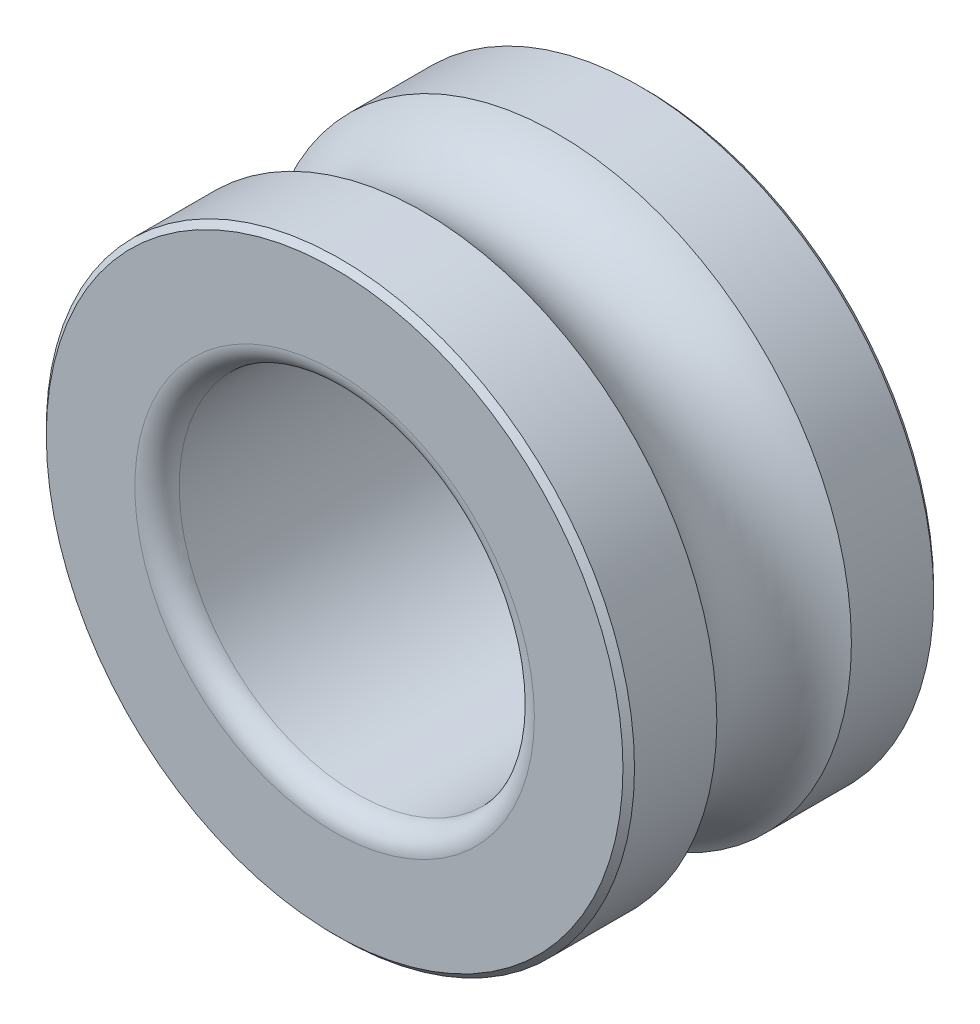
ISO-10303-21;
HEADER;
FILE_DESCRIPTION(('STEP AP214'),'2;1');
FILE_NAME('part.step','',(''),(''),'','','');
FILE_SCHEMA(('AUTOMOTIVE_DESIGN { 1 0 10303 214 1 1 1 1 }'));
ENDSEC;
DATA;
#1=APPLICATION_CONTEXT('core data for automotive mechanical design processes');
#2=APPLICATION_PROTOCOL_DEFINITION('international standard','automotive_design',2000,#1);
#3=PRODUCT_CONTEXT('',#1,'mechanical');
#4=PRODUCT('Part','Part','',(#3));
#5=PRODUCT_RELATED_PRODUCT_CATEGORY('part','',(#4));
#6=PRODUCT_DEFINITION_FORMATION('','',#4);
#7=PRODUCT_DEFINITION_CONTEXT('part definition',#1,'design');
#8=PRODUCT_DEFINITION('design','',#6,#7);
#9=PRODUCT_DEFINITION_SHAPE('','',#8);
#10=(LENGTH_UNIT() NAMED_UNIT(*) SI_UNIT(.MILLI.,.METRE.));
#11=(NAMED_UNIT(*) PLANE_ANGLE_UNIT() SI_UNIT($,.RADIAN.));
#12=(NAMED_UNIT(*) SI_UNIT($,.STERADIAN.) SOLID_ANGLE_UNIT());
#13=UNCERTAINTY_MEASURE_WITH_UNIT(LENGTH_MEASURE(1.E-05),#10,'distance_accuracy_value','');
#14=(GEOMETRIC_REPRESENTATION_CONTEXT(3) GLOBAL_UNCERTAINTY_ASSIGNED_CONTEXT((#13)) GLOBAL_UNIT_ASSIGNED_CONTEXT((#10,
#11,#12)) REPRESENTATION_CONTEXT('',''));
#15=CARTESIAN_POINT('',(0.,0.,0.));
#16=DIRECTION('',(0.,0.,1.));
#17=DIRECTION('',(1.,0.,0.));
#18=AXIS2_PLACEMENT_3D('',#15,#16,#17);
#19=CARTESIAN_POINT('',(0.,0.,0.));
#20=DIRECTION('',(0.,0.,1.));
#21=DIRECTION('',(1.,0.,0.));
#22=AXIS2_PLACEMENT_3D('',#19,#20,#21);
#23=TOROIDAL_SURFACE('',#22,7.5,1.75);
#24=CARTESIAN_POINT('',(0.,0.,1.51554445662277));
#25=DIRECTION('',(0.,0.,1.));
#26=DIRECTION('',(1.,0.,0.));
#27=AXIS2_PLACEMENT_3D('',#24,#25,#26);
#28=CIRCLE('',#27,6.625);
#29=CARTESIAN_POINT('',(6.625,0.,1.51554445662277));
#30=VERTEX_POINT('',#29);
#31=EDGE_CURVE('E10',#30,#30,#28,.T.);
#32=ORIENTED_EDGE('',*,*,#31,.F.);
#33=EDGE_LOOP('',(#32));
#34=FACE_BOUND('',#33,.T.);
#35=CARTESIAN_POINT('',(0.,0.,-1.51554445662277));
#36=DIRECTION('',(0.,0.,1.));
#37=DIRECTION('',(1.,0.,0.));
#38=AXIS2_PLACEMENT_3D('',#35,#36,#37);
#39=CIRCLE('',#38,6.625);
#40=CARTESIAN_POINT('',(6.625,0.,-1.51554445662277));
#41=VERTEX_POINT('',#40);
#42=EDGE_CURVE('E65',#41,#41,#39,.T.);
#43=ORIENTED_EDGE('',*,*,#42,.T.);
#44=EDGE_LOOP('',(#43));
#45=FACE_BOUND('',#44,.T.);
#46=ADVANCED_FACE('F31',(#34,#45),#23,.F.);
#47=CARTESIAN_POINT('',(0.,0.,3.5));
#48=DIRECTION('',(0.,0.,1.));
#49=DIRECTION('',(1.,0.,0.));
#50=AXIS2_PLACEMENT_3D('',#47,#48,#49);
#51=CYLINDRICAL_SURFACE('',#50,6.625);
#52=CARTESIAN_POINT('',(0.,0.,3.37));
#53=DIRECTION('',(0.,0.,1.));
#54=DIRECTION('',(1.,0.,0.));
#55=AXIS2_PLACEMENT_3D('',#52,#53,#54);
#56=CIRCLE('',#55,6.625);
#57=CARTESIAN_POINT('',(6.625,0.,3.37));
#58=VERTEX_POINT('',#57);
#59=EDGE_CURVE('E37',#58,#58,#56,.T.);
#60=ORIENTED_EDGE('',*,*,#59,.F.);
#61=EDGE_LOOP('',(#60));
#62=FACE_BOUND('',#61,.T.);
#63=ORIENTED_EDGE('',*,*,#31,.T.);
#64=EDGE_LOOP('',(#63));
#65=FACE_BOUND('',#64,.T.);
#66=ADVANCED_FACE('F114',(#62,#65),#51,.T.);
#67=CARTESIAN_POINT('',(0.,0.,3.37));
#68=DIRECTION('',(0.,0.,-1.));
#69=DIRECTION('',(-1.,0.,0.));
#70=AXIS2_PLACEMENT_3D('',#67,#68,#69);
#71=CONICAL_SURFACE('',#70,6.625,0.785398163397447);
#72=CARTESIAN_POINT('',(0.,0.,3.5));
#73=DIRECTION('',(0.,0.,1.));
#74=DIRECTION('',(1.,0.,0.));
#75=AXIS2_PLACEMENT_3D('',#72,#73,#74);
#76=CIRCLE('',#75,6.495);
#77=CARTESIAN_POINT('',(6.495,0.,3.5));
#78=VERTEX_POINT('',#77);
#79=EDGE_CURVE('E41',#78,#78,#76,.T.);
#80=ORIENTED_EDGE('',*,*,#79,.F.);
#81=EDGE_LOOP('',(#80));
#82=FACE_BOUND('',#81,.T.);
#83=ORIENTED_EDGE('',*,*,#59,.T.);
#84=EDGE_LOOP('',(#83));
#85=FACE_BOUND('',#84,.T.);
#86=ADVANCED_FACE('F109',(#82,#85),#71,.T.);
#87=CARTESIAN_POINT('',(0.,4.5,3.5));
#88=DIRECTION('',(0.,0.,-1.));
#89=DIRECTION('',(-1.,0.,0.));
#90=AXIS2_PLACEMENT_3D('',#87,#88,#89);
#91=PLANE('',#90);
#92=CARTESIAN_POINT('',(0.,0.,3.5));
#93=DIRECTION('',(0.,0.,1.));
#94=DIRECTION('',(1.,0.,0.));
#95=AXIS2_PLACEMENT_3D('',#92,#93,#94);
#96=CIRCLE('',#95,4.5);
#97=CARTESIAN_POINT('',(4.5,0.,3.5));
#98=VERTEX_POINT('',#97);
#99=EDGE_CURVE('E45',#98,#98,#96,.T.);
#100=ORIENTED_EDGE('',*,*,#99,.F.);
#101=EDGE_LOOP('',(#100));
#102=FACE_BOUND('',#101,.T.);
#103=ORIENTED_EDGE('',*,*,#79,.T.);
#104=EDGE_LOOP('',(#103));
#105=FACE_BOUND('',#104,.T.);
#106=ADVANCED_FACE('F103',(#102,#105),#91,.F.);
#107=CARTESIAN_POINT('',(0.,0.,3.));
#108=DIRECTION('',(0.,0.,1.));
#109=DIRECTION('',(1.,0.,0.));
#110=AXIS2_PLACEMENT_3D('',#107,#108,#109);
#111=TOROIDAL_SURFACE('',#110,4.5,0.5);
#112=CARTESIAN_POINT('',(0.,0.,3.));
#113=DIRECTION('',(0.,0.,1.));
#114=DIRECTION('',(1.,0.,0.));
#115=AXIS2_PLACEMENT_3D('',#112,#113,#114);
#116=CIRCLE('',#115,4.);
#117=CARTESIAN_POINT('',(4.,0.,3.));
#118=VERTEX_POINT('',#117);
#119=EDGE_CURVE('E50',#118,#118,#116,.T.);
#120=ORIENTED_EDGE('',*,*,#119,.F.);
#121=EDGE_LOOP('',(#120));
#122=FACE_BOUND('',#121,.T.);
#123=ORIENTED_EDGE('',*,*,#99,.T.);
#124=EDGE_LOOP('',(#123));
#125=FACE_BOUND('',#124,.T.);
#126=ADVANCED_FACE('F97',(#122,#125),#111,.T.);
#127=CARTESIAN_POINT('',(0.,0.,3.5));
#128=DIRECTION('',(0.,0.,1.));
#129=DIRECTION('',(1.,0.,0.));
#130=AXIS2_PLACEMENT_3D('',#127,#128,#129);
#131=CYLINDRICAL_SURFACE('',#130,4.);
#132=CARTESIAN_POINT('',(0.,0.,-3.));
#133=DIRECTION('',(0.,0.,1.));
#134=DIRECTION('',(1.,0.,0.));
#135=AXIS2_PLACEMENT_3D('',#132,#133,#134);
#136=CIRCLE('',#135,4.);
#137=CARTESIAN_POINT('',(4.,0.,-3.));
#138=VERTEX_POINT('',#137);
#139=EDGE_CURVE('E53',#138,#138,#136,.T.);
#140=ORIENTED_EDGE('',*,*,#139,.F.);
#141=EDGE_LOOP('',(#140));
#142=FACE_BOUND('',#141,.T.);
#143=ORIENTED_EDGE('',*,*,#119,.T.);
#144=EDGE_LOOP('',(#143));
#145=FACE_BOUND('',#144,.T.);
#146=ADVANCED_FACE('F91',(#142,#145),#131,.F.);
#147=CARTESIAN_POINT('',(0.,0.,-3.));
#148=DIRECTION('',(0.,0.,1.));
#149=DIRECTION('',(1.,0.,0.));
#150=AXIS2_PLACEMENT_3D('',#147,#148,#149);
#151=TOROIDAL_SURFACE('',#150,4.5,0.5);
#152=CARTESIAN_POINT('',(0.,0.,-3.5));
#153=DIRECTION('',(0.,0.,1.));
#154=DIRECTION('',(1.,0.,0.));
#155=AXIS2_PLACEMENT_3D('',#152,#153,#154);
#156=CIRCLE('',#155,4.5);
#157=CARTESIAN_POINT('',(4.5,0.,-3.5));
#158=VERTEX_POINT('',#157);
#159=EDGE_CURVE('E56',#158,#158,#156,.T.);
#160=ORIENTED_EDGE('',*,*,#159,.F.);
#161=EDGE_LOOP('',(#160));
#162=FACE_BOUND('',#161,.T.);
#163=ORIENTED_EDGE('',*,*,#139,.T.);
#164=EDGE_LOOP('',(#163));
#165=FACE_BOUND('',#164,.T.);
#166=ADVANCED_FACE('F85',(#162,#165),#151,.T.);
#167=CARTESIAN_POINT('',(0.,4.5,-3.5));
#168=DIRECTION('',(0.,0.,1.));
#169=DIRECTION('',(1.,0.,0.));
#170=AXIS2_PLACEMENT_3D('',#167,#168,#169);
#171=PLANE('',#170);
#172=CARTESIAN_POINT('',(0.,0.,-3.5));
#173=DIRECTION('',(0.,0.,1.));
#174=DIRECTION('',(1.,0.,0.));
#175=AXIS2_PLACEMENT_3D('',#172,#173,#174);
#176=CIRCLE('',#175,6.495);
#177=CARTESIAN_POINT('',(6.495,0.,-3.5));
#178=VERTEX_POINT('',#177);
#179=EDGE_CURVE('E59',#178,#178,#176,.T.);
#180=ORIENTED_EDGE('',*,*,#179,.F.);
#181=EDGE_LOOP('',(#180));
#182=FACE_BOUND('',#181,.T.);
#183=ORIENTED_EDGE('',*,*,#159,.T.);
#184=EDGE_LOOP('',(#183));
#185=FACE_BOUND('',#184,.T.);
#186=ADVANCED_FACE('F79',(#182,#185),#171,.F.);
#187=CARTESIAN_POINT('',(0.,0.,-3.5));
#188=DIRECTION('',(0.,0.,1.));
#189=DIRECTION('',(1.,0.,0.));
#190=AXIS2_PLACEMENT_3D('',#187,#188,#189);
#191=CONICAL_SURFACE('',#190,6.495,0.785398163397448);
#192=CARTESIAN_POINT('',(0.,0.,-3.37));
#193=DIRECTION('',(0.,0.,1.));
#194=DIRECTION('',(1.,0.,0.));
#195=AXIS2_PLACEMENT_3D('',#192,#193,#194);
#196=CIRCLE('',#195,6.625);
#197=CARTESIAN_POINT('',(6.625,0.,-3.37));
#198=VERTEX_POINT('',#197);
#199=EDGE_CURVE('E62',#198,#198,#196,.T.);
#200=ORIENTED_EDGE('',*,*,#199,.F.);
#201=EDGE_LOOP('',(#200));
#202=FACE_BOUND('',#201,.T.);
#203=ORIENTED_EDGE('',*,*,#179,.T.);
#204=EDGE_LOOP('',(#203));
#205=FACE_BOUND('',#204,.T.);
#206=ADVANCED_FACE('F73',(#202,#205),#191,.T.);
#207=CARTESIAN_POINT('',(0.,0.,3.5));
#208=DIRECTION('',(0.,0.,1.));
#209=DIRECTION('',(1.,0.,0.));
#210=AXIS2_PLACEMENT_3D('',#207,#208,#209);
#211=CYLINDRICAL_SURFACE('',#210,6.625);
#212=ORIENTED_EDGE('',*,*,#42,.F.);
#213=EDGE_LOOP('',(#212));
#214=FACE_BOUND('',#213,.T.);
#215=ORIENTED_EDGE('',*,*,#199,.T.);
#216=EDGE_LOOP('',(#215));
#217=FACE_BOUND('',#216,.T.);
#218=ADVANCED_FACE('F70',(#214,#217),#211,.T.);
#219=CLOSED_SHELL('',(#46,#66,#86,#106,#126,#146,#166,#186,#206,#218));
#220=MANIFOLD_SOLID_BREP('B2',#219);
#221=ADVANCED_BREP_SHAPE_REPRESENTATION('',(#18,#220),#14);
#222=SHAPE_DEFINITION_REPRESENTATION(#9,#221);
ENDSEC;
END-ISO-10303-21;
